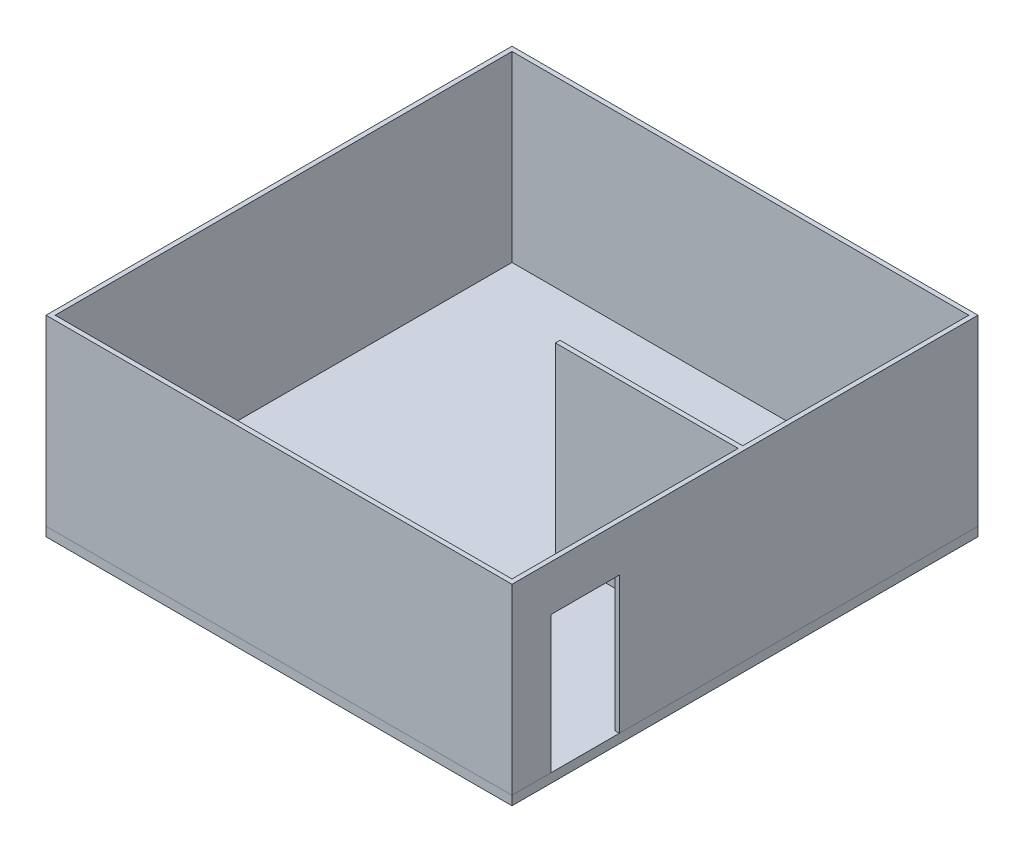
ISO-10303-21;
HEADER;
FILE_DESCRIPTION(('STEP AP214'),'2;1');
FILE_NAME('part.step','',(''),(''),'','','');
FILE_SCHEMA(('AUTOMOTIVE_DESIGN { 1 0 10303 214 1 1 1 1 }'));
ENDSEC;
DATA;
#1=APPLICATION_CONTEXT('core data for automotive mechanical design processes');
#2=APPLICATION_PROTOCOL_DEFINITION('international standard','automotive_design',2000,#1);
#3=PRODUCT_CONTEXT('',#1,'mechanical');
#4=PRODUCT('Part','Part','',(#3));
#5=PRODUCT_RELATED_PRODUCT_CATEGORY('part','',(#4));
#6=PRODUCT_DEFINITION_FORMATION('','',#4);
#7=PRODUCT_DEFINITION_CONTEXT('part definition',#1,'design');
#8=PRODUCT_DEFINITION('design','',#6,#7);
#9=PRODUCT_DEFINITION_SHAPE('','',#8);
#10=(LENGTH_UNIT() NAMED_UNIT(*) SI_UNIT(.MILLI.,.METRE.));
#11=(NAMED_UNIT(*) PLANE_ANGLE_UNIT() SI_UNIT($,.RADIAN.));
#12=(NAMED_UNIT(*) SI_UNIT($,.STERADIAN.) SOLID_ANGLE_UNIT());
#13=UNCERTAINTY_MEASURE_WITH_UNIT(LENGTH_MEASURE(1.E-05),#10,'distance_accuracy_value','');
#14=(GEOMETRIC_REPRESENTATION_CONTEXT(3) GLOBAL_UNCERTAINTY_ASSIGNED_CONTEXT((#13)) GLOBAL_UNIT_ASSIGNED_CONTEXT((#10,
#11,#12)) REPRESENTATION_CONTEXT('',''));
#15=CARTESIAN_POINT('',(0.,0.,0.));
#16=DIRECTION('',(0.,0.,1.));
#17=DIRECTION('',(1.,0.,0.));
#18=AXIS2_PLACEMENT_3D('',#15,#16,#17);
#19=CARTESIAN_POINT('',(5100.,-200.,5100.));
#20=DIRECTION('',(-1.,0.,0.));
#21=DIRECTION('',(0.,0.,1.));
#22=AXIS2_PLACEMENT_3D('',#19,#20,#21);
#23=PLANE('',#22);
#24=DIRECTION('',(0.,0.,1.));
#25=VECTOR('',#24,1.);
#26=CARTESIAN_POINT('',(5100.,0.,5100.));
#27=LINE('',#26,#25);
#28=CARTESIAN_POINT('',(5100.,0.,-5100.));
#29=VERTEX_POINT('',#28);
#30=CARTESIAN_POINT('',(5100.,0.,5100.));
#31=VERTEX_POINT('',#30);
#32=EDGE_CURVE('E124',#29,#31,#27,.T.);
#33=ORIENTED_EDGE('',*,*,#32,.T.);
#34=DIRECTION('',(0.,1.,0.));
#35=VECTOR('',#34,1.);
#36=CARTESIAN_POINT('',(5100.,-200.,5100.));
#37=LINE('',#36,#35);
#38=CARTESIAN_POINT('',(5100.,-200.,5100.));
#39=VERTEX_POINT('',#38);
#40=EDGE_CURVE('E12',#39,#31,#37,.T.);
#41=ORIENTED_EDGE('',*,*,#40,.F.);
#42=DIRECTION('',(0.,0.,1.));
#43=VECTOR('',#42,1.);
#44=CARTESIAN_POINT('',(5100.,-200.,5100.));
#45=LINE('',#44,#43);
#46=CARTESIAN_POINT('',(5100.,-200.,-5100.));
#47=VERTEX_POINT('',#46);
#48=EDGE_CURVE('E107',#47,#39,#45,.T.);
#49=ORIENTED_EDGE('',*,*,#48,.F.);
#50=DIRECTION('',(0.,1.,0.));
#51=VECTOR('',#50,1.);
#52=CARTESIAN_POINT('',(5100.,-200.,-5100.));
#53=LINE('',#52,#51);
#54=EDGE_CURVE('E120',#47,#29,#53,.T.);
#55=ORIENTED_EDGE('',*,*,#54,.T.);
#56=EDGE_LOOP('',(#33,#41,#49,#55));
#57=FACE_BOUND('',#56,.T.);
#58=ADVANCED_FACE('F55',(#57),#23,.F.);
#59=CARTESIAN_POINT('',(-5100.,-200.,5100.));
#60=DIRECTION('',(0.,0.,-1.));
#61=DIRECTION('',(-1.,0.,0.));
#62=AXIS2_PLACEMENT_3D('',#59,#60,#61);
#63=PLANE('',#62);
#64=DIRECTION('',(-1.,0.,0.));
#65=VECTOR('',#64,1.);
#66=CARTESIAN_POINT('',(-5100.,0.,5100.));
#67=LINE('',#66,#65);
#68=CARTESIAN_POINT('',(-5100.,0.,5100.));
#69=VERTEX_POINT('',#68);
#70=EDGE_CURVE('E113',#31,#69,#67,.T.);
#71=ORIENTED_EDGE('',*,*,#70,.T.);
#72=DIRECTION('',(0.,1.,0.));
#73=VECTOR('',#72,1.);
#74=CARTESIAN_POINT('',(-5100.,-200.,5100.));
#75=LINE('',#74,#73);
#76=CARTESIAN_POINT('',(-5100.,-200.,5100.));
#77=VERTEX_POINT('',#76);
#78=EDGE_CURVE('E64',#77,#69,#75,.T.);
#79=ORIENTED_EDGE('',*,*,#78,.F.);
#80=DIRECTION('',(-1.,0.,0.));
#81=VECTOR('',#80,1.);
#82=CARTESIAN_POINT('',(-5100.,-200.,5100.));
#83=LINE('',#82,#81);
#84=EDGE_CURVE('E102',#39,#77,#83,.T.);
#85=ORIENTED_EDGE('',*,*,#84,.F.);
#86=ORIENTED_EDGE('',*,*,#40,.T.);
#87=EDGE_LOOP('',(#71,#79,#85,#86));
#88=FACE_BOUND('',#87,.T.);
#89=ADVANCED_FACE('F111',(#88),#63,.F.);
#90=CARTESIAN_POINT('',(-5100.,-200.,5100.));
#91=DIRECTION('',(1.,0.,0.));
#92=DIRECTION('',(0.,0.,-1.));
#93=AXIS2_PLACEMENT_3D('',#90,#91,#92);
#94=PLANE('',#93);
#95=DIRECTION('',(0.,0.,-1.));
#96=VECTOR('',#95,1.);
#97=CARTESIAN_POINT('',(-5100.,0.,5100.));
#98=LINE('',#97,#96);
#99=CARTESIAN_POINT('',(-5100.,0.,-5100.));
#100=VERTEX_POINT('',#99);
#101=EDGE_CURVE('E89',#69,#100,#98,.T.);
#102=ORIENTED_EDGE('',*,*,#101,.T.);
#103=DIRECTION('',(0.,1.,0.));
#104=VECTOR('',#103,1.);
#105=CARTESIAN_POINT('',(-5100.,-200.,-5100.));
#106=LINE('',#105,#104);
#107=CARTESIAN_POINT('',(-5100.,-200.,-5100.));
#108=VERTEX_POINT('',#107);
#109=EDGE_CURVE('E115',#108,#100,#106,.T.);
#110=ORIENTED_EDGE('',*,*,#109,.F.);
#111=DIRECTION('',(0.,0.,-1.));
#112=VECTOR('',#111,1.);
#113=CARTESIAN_POINT('',(-5100.,-200.,5100.));
#114=LINE('',#113,#112);
#115=EDGE_CURVE('E105',#77,#108,#114,.T.);
#116=ORIENTED_EDGE('',*,*,#115,.F.);
#117=ORIENTED_EDGE('',*,*,#78,.T.);
#118=EDGE_LOOP('',(#102,#110,#116,#117));
#119=FACE_BOUND('',#118,.T.);
#120=ADVANCED_FACE('F116',(#119),#94,.F.);
#121=CARTESIAN_POINT('',(-5100.,-200.,-5100.));
#122=DIRECTION('',(0.,0.,1.));
#123=DIRECTION('',(1.,0.,0.));
#124=AXIS2_PLACEMENT_3D('',#121,#122,#123);
#125=PLANE('',#124);
#126=DIRECTION('',(1.,0.,0.));
#127=VECTOR('',#126,1.);
#128=CARTESIAN_POINT('',(-5100.,0.,-5100.));
#129=LINE('',#128,#127);
#130=EDGE_CURVE('E95',#100,#29,#129,.T.);
#131=ORIENTED_EDGE('',*,*,#130,.T.);
#132=ORIENTED_EDGE('',*,*,#54,.F.);
#133=DIRECTION('',(1.,0.,0.));
#134=VECTOR('',#133,1.);
#135=CARTESIAN_POINT('',(-5100.,-200.,-5100.));
#136=LINE('',#135,#134);
#137=EDGE_CURVE('E72',#108,#47,#136,.T.);
#138=ORIENTED_EDGE('',*,*,#137,.F.);
#139=ORIENTED_EDGE('',*,*,#109,.T.);
#140=EDGE_LOOP('',(#131,#132,#138,#139));
#141=FACE_BOUND('',#140,.T.);
#142=ADVANCED_FACE('F136',(#141),#125,.F.);
#143=CARTESIAN_POINT('',(0.,-200.,0.));
#144=DIRECTION('',(0.,-1.,0.));
#145=DIRECTION('',(0.,0.,-1.));
#146=AXIS2_PLACEMENT_3D('',#143,#144,#145);
#147=PLANE('',#146);
#148=ORIENTED_EDGE('',*,*,#48,.T.);
#149=ORIENTED_EDGE('',*,*,#84,.T.);
#150=ORIENTED_EDGE('',*,*,#115,.T.);
#151=ORIENTED_EDGE('',*,*,#137,.T.);
#152=EDGE_LOOP('',(#148,#149,#150,#151));
#153=FACE_BOUND('',#152,.T.);
#154=ADVANCED_FACE('F103',(#153),#147,.T.);
#155=CARTESIAN_POINT('',(0.,0.,0.));
#156=DIRECTION('',(0.,-1.,0.));
#157=DIRECTION('',(0.,0.,-1.));
#158=AXIS2_PLACEMENT_3D('',#155,#156,#157);
#159=PLANE('',#158);
#160=ORIENTED_EDGE('',*,*,#70,.F.);
#161=ORIENTED_EDGE('',*,*,#32,.F.);
#162=ORIENTED_EDGE('',*,*,#130,.F.);
#163=ORIENTED_EDGE('',*,*,#101,.F.);
#164=EDGE_LOOP('',(#160,#161,#162,#163));
#165=FACE_BOUND('',#164,.T.);
#166=ADVANCED_FACE('F139',(#165),#159,.F.);
#167=CLOSED_SHELL('',(#58,#89,#120,#142,#154,#166));
#168=MANIFOLD_SOLID_BREP('B2',#167);
#169=CARTESIAN_POINT('',(0.,4000.,-5000.));
#170=DIRECTION('',(0.,0.,-1.));
#171=DIRECTION('',(-1.,0.,0.));
#172=AXIS2_PLACEMENT_3D('',#169,#170,#171);
#173=PLANE('',#172);
#174=DIRECTION('',(1.,0.,0.));
#175=VECTOR('',#174,1.);
#176=CARTESIAN_POINT('',(0.,0.,-5000.));
#177=LINE('',#176,#175);
#178=CARTESIAN_POINT('',(-5000.,0.,-5000.));
#179=VERTEX_POINT('',#178);
#180=CARTESIAN_POINT('',(5000.,0.,-5000.));
#181=VERTEX_POINT('',#180);
#182=EDGE_CURVE('E352',#179,#181,#177,.T.);
#183=ORIENTED_EDGE('',*,*,#182,.T.);
#184=DIRECTION('',(0.,-1.,0.));
#185=VECTOR('',#184,1.);
#186=CARTESIAN_POINT('',(5000.,4000.,-5000.));
#187=LINE('',#186,#185);
#188=CARTESIAN_POINT('',(5000.,4000.,-5000.));
#189=VERTEX_POINT('',#188);
#190=EDGE_CURVE('E53',#189,#181,#187,.T.);
#191=ORIENTED_EDGE('',*,*,#190,.F.);
#192=DIRECTION('',(1.,0.,0.));
#193=VECTOR('',#192,1.);
#194=CARTESIAN_POINT('',(0.,4000.,-5000.));
#195=LINE('',#194,#193);
#196=CARTESIAN_POINT('',(-5000.,4000.,-5000.));
#197=VERTEX_POINT('',#196);
#198=EDGE_CURVE('E454',#197,#189,#195,.T.);
#199=ORIENTED_EDGE('',*,*,#198,.F.);
#200=DIRECTION('',(0.,-1.,0.));
#201=VECTOR('',#200,1.);
#202=CARTESIAN_POINT('',(-5000.,4000.,-5000.));
#203=LINE('',#202,#201);
#204=EDGE_CURVE('E225',#197,#179,#203,.T.);
#205=ORIENTED_EDGE('',*,*,#204,.T.);
#206=EDGE_LOOP('',(#183,#191,#199,#205));
#207=FACE_BOUND('',#206,.T.);
#208=ADVANCED_FACE('F199',(#207),#173,.F.);
#209=CARTESIAN_POINT('',(5000.,4000.,-8.88178419700125E-13));
#210=DIRECTION('',(1.,0.,0.));
#211=DIRECTION('',(0.,0.,-1.));
#212=AXIS2_PLACEMENT_3D('',#209,#210,#211);
#213=PLANE('',#212);
#214=DIRECTION('',(0.,0.,1.));
#215=VECTOR('',#214,1.);
#216=CARTESIAN_POINT('',(5000.,0.,-8.88178419700125E-13));
#217=LINE('',#216,#215);
#218=CARTESIAN_POINT('',(5000.,0.,-49.9999999999998));
#219=VERTEX_POINT('',#218);
#220=EDGE_CURVE('E354',#181,#219,#217,.T.);
#221=ORIENTED_EDGE('',*,*,#220,.T.);
#222=DIRECTION('',(0.,-1.,0.));
#223=VECTOR('',#222,1.);
#224=CARTESIAN_POINT('',(5000.,4000.,-49.9999999999998));
#225=LINE('',#224,#223);
#226=CARTESIAN_POINT('',(5000.,4000.,-49.9999999999998));
#227=VERTEX_POINT('',#226);
#228=EDGE_CURVE('E208',#227,#219,#225,.T.);
#229=ORIENTED_EDGE('',*,*,#228,.F.);
#230=DIRECTION('',(0.,0.,1.));
#231=VECTOR('',#230,1.);
#232=CARTESIAN_POINT('',(5000.,4000.,-8.88178419700125E-13));
#233=LINE('',#232,#231);
#234=EDGE_CURVE('E318',#189,#227,#233,.T.);
#235=ORIENTED_EDGE('',*,*,#234,.F.);
#236=ORIENTED_EDGE('',*,*,#190,.T.);
#237=EDGE_LOOP('',(#221,#229,#235,#236));
#238=FACE_BOUND('',#237,.T.);
#239=ADVANCED_FACE('F473',(#238),#213,.F.);
#240=CARTESIAN_POINT('',(0.,4000.,-50.0000000000002));
#241=DIRECTION('',(0.,0.,1.));
#242=DIRECTION('',(1.,0.,0.));
#243=AXIS2_PLACEMENT_3D('',#240,#241,#242);
#244=PLANE('',#243);
#245=DIRECTION('',(-1.,0.,0.));
#246=VECTOR('',#245,1.);
#247=CARTESIAN_POINT('',(0.,0.,-50.0000000000002));
#248=LINE('',#247,#246);
#249=CARTESIAN_POINT('',(1000.,0.,-50.0000000000001));
#250=VERTEX_POINT('',#249);
#251=EDGE_CURVE('E356',#219,#250,#248,.T.);
#252=ORIENTED_EDGE('',*,*,#251,.T.);
#253=DIRECTION('',(0.,-1.,0.));
#254=VECTOR('',#253,1.);
#255=CARTESIAN_POINT('',(1000.,4000.,-50.0000000000001));
#256=LINE('',#255,#254);
#257=CARTESIAN_POINT('',(1000.,4000.,-50.0000000000001));
#258=VERTEX_POINT('',#257);
#259=EDGE_CURVE('E376',#258,#250,#256,.T.);
#260=ORIENTED_EDGE('',*,*,#259,.F.);
#261=DIRECTION('',(-1.,0.,0.));
#262=VECTOR('',#261,1.);
#263=CARTESIAN_POINT('',(0.,4000.,-50.0000000000002));
#264=LINE('',#263,#262);
#265=EDGE_CURVE('E456',#227,#258,#264,.T.);
#266=ORIENTED_EDGE('',*,*,#265,.F.);
#267=ORIENTED_EDGE('',*,*,#228,.T.);
#268=EDGE_LOOP('',(#252,#260,#266,#267));
#269=FACE_BOUND('',#268,.T.);
#270=ADVANCED_FACE('F470',(#269),#244,.F.);
#271=CARTESIAN_POINT('',(1000.,4000.,0.));
#272=DIRECTION('',(1.,0.,0.));
#273=DIRECTION('',(0.,0.,-1.));
#274=AXIS2_PLACEMENT_3D('',#271,#272,#273);
#275=PLANE('',#274);
#276=DIRECTION('',(0.,0.,1.));
#277=VECTOR('',#276,1.);
#278=CARTESIAN_POINT('',(1000.,0.,0.));
#279=LINE('',#278,#277);
#280=CARTESIAN_POINT('',(1000.,0.,49.9999999999999));
#281=VERTEX_POINT('',#280);
#282=EDGE_CURVE('E359',#250,#281,#279,.T.);
#283=ORIENTED_EDGE('',*,*,#282,.T.);
#284=DIRECTION('',(0.,-1.,0.));
#285=VECTOR('',#284,1.);
#286=CARTESIAN_POINT('',(1000.,4000.,49.9999999999999));
#287=LINE('',#286,#285);
#288=CARTESIAN_POINT('',(1000.,4000.,49.9999999999999));
#289=VERTEX_POINT('',#288);
#290=EDGE_CURVE('E374',#289,#281,#287,.T.);
#291=ORIENTED_EDGE('',*,*,#290,.F.);
#292=DIRECTION('',(0.,0.,1.));
#293=VECTOR('',#292,1.);
#294=CARTESIAN_POINT('',(1000.,4000.,0.));
#295=LINE('',#294,#293);
#296=EDGE_CURVE('E457',#258,#289,#295,.T.);
#297=ORIENTED_EDGE('',*,*,#296,.F.);
#298=ORIENTED_EDGE('',*,*,#259,.T.);
#299=EDGE_LOOP('',(#283,#291,#297,#298));
#300=FACE_BOUND('',#299,.T.);
#301=ADVANCED_FACE('F466',(#300),#275,.F.);
#302=CARTESIAN_POINT('',(0.,4000.,50.));
#303=DIRECTION('',(0.,0.,1.));
#304=DIRECTION('',(1.,0.,0.));
#305=AXIS2_PLACEMENT_3D('',#302,#303,#304);
#306=PLANE('',#305);
#307=DIRECTION('',(-1.,0.,0.));
#308=VECTOR('',#307,1.);
#309=CARTESIAN_POINT('',(0.,0.,50.));
#310=LINE('',#309,#308);
#311=CARTESIAN_POINT('',(5000.,0.,49.9999999999996));
#312=VERTEX_POINT('',#311);
#313=EDGE_CURVE('E362',#312,#281,#310,.T.);
#314=ORIENTED_EDGE('',*,*,#313,.F.);
#315=DIRECTION('',(0.,-1.,0.));
#316=VECTOR('',#315,1.);
#317=CARTESIAN_POINT('',(5000.,4000.,49.9999999999996));
#318=LINE('',#317,#316);
#319=CARTESIAN_POINT('',(5000.,4000.,49.9999999999996));
#320=VERTEX_POINT('',#319);
#321=EDGE_CURVE('E329',#320,#312,#318,.T.);
#322=ORIENTED_EDGE('',*,*,#321,.F.);
#323=DIRECTION('',(-1.,0.,0.));
#324=VECTOR('',#323,1.);
#325=CARTESIAN_POINT('',(0.,4000.,50.));
#326=LINE('',#325,#324);
#327=EDGE_CURVE('E315',#320,#289,#326,.T.);
#328=ORIENTED_EDGE('',*,*,#327,.T.);
#329=ORIENTED_EDGE('',*,*,#290,.T.);
#330=EDGE_LOOP('',(#314,#322,#328,#329));
#331=FACE_BOUND('',#330,.T.);
#332=ADVANCED_FACE('F462',(#331),#306,.T.);
#333=DIRECTION('',(0.,0.,-1.));
#334=VECTOR('',#333,1.);
#335=CARTESIAN_POINT('',(5000.,3000.,4250.));
#336=LINE('',#335,#334);
#337=CARTESIAN_POINT('',(5000.,3000.,4250.));
#338=VERTEX_POINT('',#337);
#339=CARTESIAN_POINT('',(5000.,3000.,2750.));
#340=VERTEX_POINT('',#339);
#341=EDGE_CURVE('E438',#338,#340,#336,.T.);
#342=ORIENTED_EDGE('',*,*,#341,.F.);
#343=DIRECTION('',(0.,1.,0.));
#344=VECTOR('',#343,1.);
#345=CARTESIAN_POINT('',(5000.,0.,4250.));
#346=LINE('',#345,#344);
#347=CARTESIAN_POINT('',(5000.,0.,4250.));
#348=VERTEX_POINT('',#347);
#349=EDGE_CURVE('E440',#348,#338,#346,.T.);
#350=ORIENTED_EDGE('',*,*,#349,.F.);
#351=CARTESIAN_POINT('',(5000.,0.,5000.));
#352=VERTEX_POINT('',#351);
#353=EDGE_CURVE('E325',#348,#352,#217,.T.);
#354=ORIENTED_EDGE('',*,*,#353,.T.);
#355=DIRECTION('',(0.,-1.,0.));
#356=VECTOR('',#355,1.);
#357=CARTESIAN_POINT('',(5000.,4000.,5000.));
#358=LINE('',#357,#356);
#359=CARTESIAN_POINT('',(5000.,4000.,5000.));
#360=VERTEX_POINT('',#359);
#361=EDGE_CURVE('E320',#360,#352,#358,.T.);
#362=ORIENTED_EDGE('',*,*,#361,.F.);
#363=EDGE_CURVE('E307',#320,#360,#233,.T.);
#364=ORIENTED_EDGE('',*,*,#363,.F.);
#365=ORIENTED_EDGE('',*,*,#321,.T.);
#366=CARTESIAN_POINT('',(5000.,0.,2750.));
#367=VERTEX_POINT('',#366);
#368=EDGE_CURVE('E357',#312,#367,#217,.T.);
#369=ORIENTED_EDGE('',*,*,#368,.T.);
#370=DIRECTION('',(0.,-1.,0.));
#371=VECTOR('',#370,1.);
#372=CARTESIAN_POINT('',(5000.,1.83697019872103E-13,2750.));
#373=LINE('',#372,#371);
#374=EDGE_CURVE('E216',#340,#367,#373,.T.);
#375=ORIENTED_EDGE('',*,*,#374,.F.);
#376=EDGE_LOOP('',(#342,#350,#354,#362,#364,#365,#369,#375));
#377=FACE_BOUND('',#376,.T.);
#378=ADVANCED_FACE('F322',(#377),#213,.F.);
#379=CARTESIAN_POINT('',(0.,4000.,5000.));
#380=DIRECTION('',(0.,0.,-1.));
#381=DIRECTION('',(-1.,0.,0.));
#382=AXIS2_PLACEMENT_3D('',#379,#380,#381);
#383=PLANE('',#382);
#384=DIRECTION('',(1.,0.,0.));
#385=VECTOR('',#384,1.);
#386=CARTESIAN_POINT('',(0.,0.,5000.));
#387=LINE('',#386,#385);
#388=CARTESIAN_POINT('',(-5000.,0.,5000.));
#389=VERTEX_POINT('',#388);
#390=EDGE_CURVE('E365',#389,#352,#387,.T.);
#391=ORIENTED_EDGE('',*,*,#390,.F.);
#392=DIRECTION('',(0.,-1.,0.));
#393=VECTOR('',#392,1.);
#394=CARTESIAN_POINT('',(-5000.,4000.,5000.));
#395=LINE('',#394,#393);
#396=CARTESIAN_POINT('',(-5000.,4000.,5000.));
#397=VERTEX_POINT('',#396);
#398=EDGE_CURVE('E330',#397,#389,#395,.T.);
#399=ORIENTED_EDGE('',*,*,#398,.F.);
#400=DIRECTION('',(1.,0.,0.));
#401=VECTOR('',#400,1.);
#402=CARTESIAN_POINT('',(0.,4000.,5000.));
#403=LINE('',#402,#401);
#404=EDGE_CURVE('E313',#397,#360,#403,.T.);
#405=ORIENTED_EDGE('',*,*,#404,.T.);
#406=ORIENTED_EDGE('',*,*,#361,.T.);
#407=EDGE_LOOP('',(#391,#399,#405,#406));
#408=FACE_BOUND('',#407,.T.);
#409=ADVANCED_FACE('F332',(#408),#383,.T.);
#410=CARTESIAN_POINT('',(0.,4000.,-5100.));
#411=DIRECTION('',(0.,0.,-1.));
#412=DIRECTION('',(-1.,0.,0.));
#413=AXIS2_PLACEMENT_3D('',#410,#411,#412);
#414=PLANE('',#413);
#415=DIRECTION('',(1.,0.,0.));
#416=VECTOR('',#415,1.);
#417=CARTESIAN_POINT('',(0.,0.,-5100.));
#418=LINE('',#417,#416);
#419=CARTESIAN_POINT('',(-5100.,0.,-5100.));
#420=VERTEX_POINT('',#419);
#421=CARTESIAN_POINT('',(5100.,0.,-5100.));
#422=VERTEX_POINT('',#421);
#423=EDGE_CURVE('E340',#420,#422,#418,.T.);
#424=ORIENTED_EDGE('',*,*,#423,.F.);
#425=DIRECTION('',(0.,-1.,0.));
#426=VECTOR('',#425,1.);
#427=CARTESIAN_POINT('',(-5100.,4000.,-5100.));
#428=LINE('',#427,#426);
#429=CARTESIAN_POINT('',(-5100.,4000.,-5100.));
#430=VERTEX_POINT('',#429);
#431=EDGE_CURVE('E203',#430,#420,#428,.T.);
#432=ORIENTED_EDGE('',*,*,#431,.F.);
#433=DIRECTION('',(1.,0.,0.));
#434=VECTOR('',#433,1.);
#435=CARTESIAN_POINT('',(0.,4000.,-5100.));
#436=LINE('',#435,#434);
#437=CARTESIAN_POINT('',(5100.,4000.,-5100.));
#438=VERTEX_POINT('',#437);
#439=EDGE_CURVE('E370',#430,#438,#436,.T.);
#440=ORIENTED_EDGE('',*,*,#439,.T.);
#441=DIRECTION('',(0.,-1.,0.));
#442=VECTOR('',#441,1.);
#443=CARTESIAN_POINT('',(5100.,4000.,-5100.));
#444=LINE('',#443,#442);
#445=EDGE_CURVE('E335',#438,#422,#444,.T.);
#446=ORIENTED_EDGE('',*,*,#445,.T.);
#447=EDGE_LOOP('',(#424,#432,#440,#446));
#448=FACE_BOUND('',#447,.T.);
#449=ADVANCED_FACE('F201',(#448),#414,.T.);
#450=CARTESIAN_POINT('',(-5100.,4000.,4.44089209850063E-13));
#451=DIRECTION('',(1.,0.,0.));
#452=DIRECTION('',(0.,0.,-1.));
#453=AXIS2_PLACEMENT_3D('',#450,#451,#452);
#454=PLANE('',#453);
#455=DIRECTION('',(0.,0.,1.));
#456=VECTOR('',#455,1.);
#457=CARTESIAN_POINT('',(-5100.,0.,4.44089209850063E-13));
#458=LINE('',#457,#456);
#459=CARTESIAN_POINT('',(-5100.,0.,5100.));
#460=VERTEX_POINT('',#459);
#461=EDGE_CURVE('E343',#420,#460,#458,.T.);
#462=ORIENTED_EDGE('',*,*,#461,.T.);
#463=DIRECTION('',(0.,-1.,0.));
#464=VECTOR('',#463,1.);
#465=CARTESIAN_POINT('',(-5100.,4000.,5100.));
#466=LINE('',#465,#464);
#467=CARTESIAN_POINT('',(-5100.,4000.,5100.));
#468=VERTEX_POINT('',#467);
#469=EDGE_CURVE('E384',#468,#460,#466,.T.);
#470=ORIENTED_EDGE('',*,*,#469,.F.);
#471=DIRECTION('',(0.,0.,1.));
#472=VECTOR('',#471,1.);
#473=CARTESIAN_POINT('',(-5100.,4000.,4.44089209850063E-13));
#474=LINE('',#473,#472);
#475=EDGE_CURVE('E393',#430,#468,#474,.T.);
#476=ORIENTED_EDGE('',*,*,#475,.F.);
#477=ORIENTED_EDGE('',*,*,#431,.T.);
#478=EDGE_LOOP('',(#462,#470,#476,#477));
#479=FACE_BOUND('',#478,.T.);
#480=ADVANCED_FACE('F392',(#479),#454,.F.);
#481=CARTESIAN_POINT('',(0.,4000.,5100.));
#482=DIRECTION('',(0.,0.,-1.));
#483=DIRECTION('',(-1.,0.,0.));
#484=AXIS2_PLACEMENT_3D('',#481,#482,#483);
#485=PLANE('',#484);
#486=DIRECTION('',(1.,0.,0.));
#487=VECTOR('',#486,1.);
#488=CARTESIAN_POINT('',(0.,0.,5100.));
#489=LINE('',#488,#487);
#490=CARTESIAN_POINT('',(5100.,0.,5100.));
#491=VERTEX_POINT('',#490);
#492=EDGE_CURVE('E345',#460,#491,#489,.T.);
#493=ORIENTED_EDGE('',*,*,#492,.T.);
#494=DIRECTION('',(0.,-1.,0.));
#495=VECTOR('',#494,1.);
#496=CARTESIAN_POINT('',(5100.,4000.,5100.));
#497=LINE('',#496,#495);
#498=CARTESIAN_POINT('',(5100.,4000.,5100.));
#499=VERTEX_POINT('',#498);
#500=EDGE_CURVE('E382',#499,#491,#497,.T.);
#501=ORIENTED_EDGE('',*,*,#500,.F.);
#502=DIRECTION('',(1.,0.,0.));
#503=VECTOR('',#502,1.);
#504=CARTESIAN_POINT('',(0.,4000.,5100.));
#505=LINE('',#504,#503);
#506=EDGE_CURVE('E451',#468,#499,#505,.T.);
#507=ORIENTED_EDGE('',*,*,#506,.F.);
#508=ORIENTED_EDGE('',*,*,#469,.T.);
#509=EDGE_LOOP('',(#493,#501,#507,#508));
#510=FACE_BOUND('',#509,.T.);
#511=ADVANCED_FACE('F478',(#510),#485,.F.);
#512=CARTESIAN_POINT('',(5100.,4000.,-4.44089209850063E-13));
#513=DIRECTION('',(1.,0.,0.));
#514=DIRECTION('',(0.,0.,-1.));
#515=AXIS2_PLACEMENT_3D('',#512,#513,#514);
#516=PLANE('',#515);
#517=DIRECTION('',(0.,-1.,0.));
#518=VECTOR('',#517,1.);
#519=CARTESIAN_POINT('',(5100.,0.,4250.));
#520=LINE('',#519,#518);
#521=CARTESIAN_POINT('',(5100.,3000.,4250.));
#522=VERTEX_POINT('',#521);
#523=CARTESIAN_POINT('',(5100.,0.,4250.));
#524=VERTEX_POINT('',#523);
#525=EDGE_CURVE('E424',#522,#524,#520,.T.);
#526=ORIENTED_EDGE('',*,*,#525,.F.);
#527=DIRECTION('',(0.,0.,1.));
#528=VECTOR('',#527,1.);
#529=CARTESIAN_POINT('',(5100.,3000.,4250.));
#530=LINE('',#529,#528);
#531=CARTESIAN_POINT('',(5100.,3000.,2750.));
#532=VERTEX_POINT('',#531);
#533=EDGE_CURVE('E660',#532,#522,#530,.T.);
#534=ORIENTED_EDGE('',*,*,#533,.F.);
#535=DIRECTION('',(0.,1.,0.));
#536=VECTOR('',#535,1.);
#537=CARTESIAN_POINT('',(5100.,1.83697019872103E-13,2750.));
#538=LINE('',#537,#536);
#539=CARTESIAN_POINT('',(5100.,1.83697019872103E-13,2750.));
#540=VERTEX_POINT('',#539);
#541=EDGE_CURVE('E408',#540,#532,#538,.T.);
#542=ORIENTED_EDGE('',*,*,#541,.F.);
#543=DIRECTION('',(0.,0.,1.));
#544=VECTOR('',#543,1.);
#545=CARTESIAN_POINT('',(5100.,0.,-4.44089209850063E-13));
#546=LINE('',#545,#544);
#547=EDGE_CURVE('E349',#422,#540,#546,.T.);
#548=ORIENTED_EDGE('',*,*,#547,.F.);
#549=ORIENTED_EDGE('',*,*,#445,.F.);
#550=DIRECTION('',(0.,0.,1.));
#551=VECTOR('',#550,1.);
#552=CARTESIAN_POINT('',(5100.,4000.,-4.44089209850063E-13));
#553=LINE('',#552,#551);
#554=EDGE_CURVE('E403',#438,#499,#553,.T.);
#555=ORIENTED_EDGE('',*,*,#554,.T.);
#556=ORIENTED_EDGE('',*,*,#500,.T.);
#557=EDGE_CURVE('E348',#524,#491,#546,.T.);
#558=ORIENTED_EDGE('',*,*,#557,.F.);
#559=EDGE_LOOP('',(#526,#534,#542,#548,#549,#555,#556,#558));
#560=FACE_BOUND('',#559,.T.);
#561=ADVANCED_FACE('F402',(#560),#516,.T.);
#562=CARTESIAN_POINT('',(-5000.,4000.,8.88178419700125E-13));
#563=DIRECTION('',(1.,0.,0.));
#564=DIRECTION('',(0.,0.,-1.));
#565=AXIS2_PLACEMENT_3D('',#562,#563,#564);
#566=PLANE('',#565);
#567=DIRECTION('',(0.,0.,1.));
#568=VECTOR('',#567,1.);
#569=CARTESIAN_POINT('',(-5000.,0.,8.88178419700125E-13));
#570=LINE('',#569,#568);
#571=EDGE_CURVE('E367',#179,#389,#570,.T.);
#572=ORIENTED_EDGE('',*,*,#571,.F.);
#573=ORIENTED_EDGE('',*,*,#204,.F.);
#574=DIRECTION('',(0.,0.,1.));
#575=VECTOR('',#574,1.);
#576=CARTESIAN_POINT('',(-5000.,4000.,8.88178419700125E-13));
#577=LINE('',#576,#575);
#578=EDGE_CURVE('E333',#197,#397,#577,.T.);
#579=ORIENTED_EDGE('',*,*,#578,.T.);
#580=ORIENTED_EDGE('',*,*,#398,.T.);
#581=EDGE_LOOP('',(#572,#573,#579,#580));
#582=FACE_BOUND('',#581,.T.);
#583=ADVANCED_FACE('F475',(#582),#566,.T.);
#584=CARTESIAN_POINT('',(0.,4000.,0.));
#585=DIRECTION('',(0.,1.,0.));
#586=DIRECTION('',(0.,0.,1.));
#587=AXIS2_PLACEMENT_3D('',#584,#585,#586);
#588=PLANE('',#587);
#589=ORIENTED_EDGE('',*,*,#439,.F.);
#590=ORIENTED_EDGE('',*,*,#475,.T.);
#591=ORIENTED_EDGE('',*,*,#506,.T.);
#592=ORIENTED_EDGE('',*,*,#554,.F.);
#593=EDGE_LOOP('',(#589,#590,#591,#592));
#594=FACE_BOUND('',#593,.T.);
#595=ORIENTED_EDGE('',*,*,#198,.T.);
#596=ORIENTED_EDGE('',*,*,#234,.T.);
#597=ORIENTED_EDGE('',*,*,#265,.T.);
#598=ORIENTED_EDGE('',*,*,#296,.T.);
#599=ORIENTED_EDGE('',*,*,#327,.F.);
#600=ORIENTED_EDGE('',*,*,#363,.T.);
#601=ORIENTED_EDGE('',*,*,#404,.F.);
#602=ORIENTED_EDGE('',*,*,#578,.F.);
#603=EDGE_LOOP('',(#595,#596,#597,#598,#599,#600,#601,#602));
#604=FACE_BOUND('',#603,.T.);
#605=ADVANCED_FACE('F310',(#594,#604),#588,.T.);
#606=CARTESIAN_POINT('',(0.,0.,0.));
#607=DIRECTION('',(0.,1.,0.));
#608=DIRECTION('',(0.,0.,1.));
#609=AXIS2_PLACEMENT_3D('',#606,#607,#608);
#610=PLANE('',#609);
#611=ORIENTED_EDGE('',*,*,#353,.F.);
#612=DIRECTION('',(1.,0.,0.));
#613=VECTOR('',#612,1.);
#614=CARTESIAN_POINT('',(-5100.001,0.,4250.));
#615=LINE('',#614,#613);
#616=EDGE_CURVE('E445',#348,#524,#615,.T.);
#617=ORIENTED_EDGE('',*,*,#616,.T.);
#618=ORIENTED_EDGE('',*,*,#557,.T.);
#619=ORIENTED_EDGE('',*,*,#492,.F.);
#620=ORIENTED_EDGE('',*,*,#461,.F.);
#621=ORIENTED_EDGE('',*,*,#423,.T.);
#622=ORIENTED_EDGE('',*,*,#547,.T.);
#623=DIRECTION('',(1.,0.,0.));
#624=VECTOR('',#623,1.);
#625=CARTESIAN_POINT('',(-5100.001,1.83697019872103E-13,2750.));
#626=LINE('',#625,#624);
#627=EDGE_CURVE('E410',#367,#540,#626,.T.);
#628=ORIENTED_EDGE('',*,*,#627,.F.);
#629=ORIENTED_EDGE('',*,*,#368,.F.);
#630=ORIENTED_EDGE('',*,*,#313,.T.);
#631=ORIENTED_EDGE('',*,*,#282,.F.);
#632=ORIENTED_EDGE('',*,*,#251,.F.);
#633=ORIENTED_EDGE('',*,*,#220,.F.);
#634=ORIENTED_EDGE('',*,*,#182,.F.);
#635=ORIENTED_EDGE('',*,*,#571,.T.);
#636=ORIENTED_EDGE('',*,*,#390,.T.);
#637=EDGE_LOOP('',(#611,#617,#618,#619,#620,#621,#622,#628,#629,#630,#631,#632,#633,#634,#635,#636));
#638=FACE_BOUND('',#637,.T.);
#639=ADVANCED_FACE('F396',(#638),#610,.F.);
#640=CARTESIAN_POINT('',(-5100.001,0.,4250.));
#641=DIRECTION('',(0.,0.,1.));
#642=DIRECTION('',(1.,0.,0.));
#643=AXIS2_PLACEMENT_3D('',#640,#641,#642);
#644=PLANE('',#643);
#645=ORIENTED_EDGE('',*,*,#349,.T.);
#646=DIRECTION('',(1.,0.,0.));
#647=VECTOR('',#646,1.);
#648=CARTESIAN_POINT('',(-5100.001,3000.,4250.));
#649=LINE('',#648,#647);
#650=EDGE_CURVE('E432',#338,#522,#649,.T.);
#651=ORIENTED_EDGE('',*,*,#650,.T.);
#652=ORIENTED_EDGE('',*,*,#525,.T.);
#653=ORIENTED_EDGE('',*,*,#616,.F.);
#654=EDGE_LOOP('',(#645,#651,#652,#653));
#655=FACE_BOUND('',#654,.T.);
#656=ADVANCED_FACE('F506',(#655),#644,.F.);
#657=CARTESIAN_POINT('',(-5100.001,3000.,4250.));
#658=DIRECTION('',(0.,1.,0.));
#659=DIRECTION('',(0.,0.,1.));
#660=AXIS2_PLACEMENT_3D('',#657,#658,#659);
#661=PLANE('',#660);
#662=ORIENTED_EDGE('',*,*,#341,.T.);
#663=DIRECTION('',(1.,0.,0.));
#664=VECTOR('',#663,1.);
#665=CARTESIAN_POINT('',(-5100.001,3000.,2750.));
#666=LINE('',#665,#664);
#667=EDGE_CURVE('E435',#340,#532,#666,.T.);
#668=ORIENTED_EDGE('',*,*,#667,.T.);
#669=ORIENTED_EDGE('',*,*,#533,.T.);
#670=ORIENTED_EDGE('',*,*,#650,.F.);
#671=EDGE_LOOP('',(#662,#668,#669,#670));
#672=FACE_BOUND('',#671,.T.);
#673=ADVANCED_FACE('F439',(#672),#661,.F.);
#674=CARTESIAN_POINT('',(-5100.001,1.83697019872103E-13,2750.));
#675=DIRECTION('',(0.,0.,-1.));
#676=DIRECTION('',(0.,1.,0.));
#677=AXIS2_PLACEMENT_3D('',#674,#675,#676);
#678=PLANE('',#677);
#679=ORIENTED_EDGE('',*,*,#374,.T.);
#680=ORIENTED_EDGE('',*,*,#627,.T.);
#681=ORIENTED_EDGE('',*,*,#541,.T.);
#682=ORIENTED_EDGE('',*,*,#667,.F.);
#683=EDGE_LOOP('',(#679,#680,#681,#682));
#684=FACE_BOUND('',#683,.T.);
#685=ADVANCED_FACE('F436',(#684),#678,.F.);
#686=CLOSED_SHELL('',(#208,#239,#270,#301,#332,#378,#409,#449,#480,#511,#561,#583,#605,#639,
#656,#673,#685));
#687=MANIFOLD_SOLID_BREP('B6',#686);
#688=ADVANCED_BREP_SHAPE_REPRESENTATION('',(#18,#168,#687),#14);
#689=SHAPE_DEFINITION_REPRESENTATION(#9,#688);
ENDSEC;
END-ISO-10303-21;
